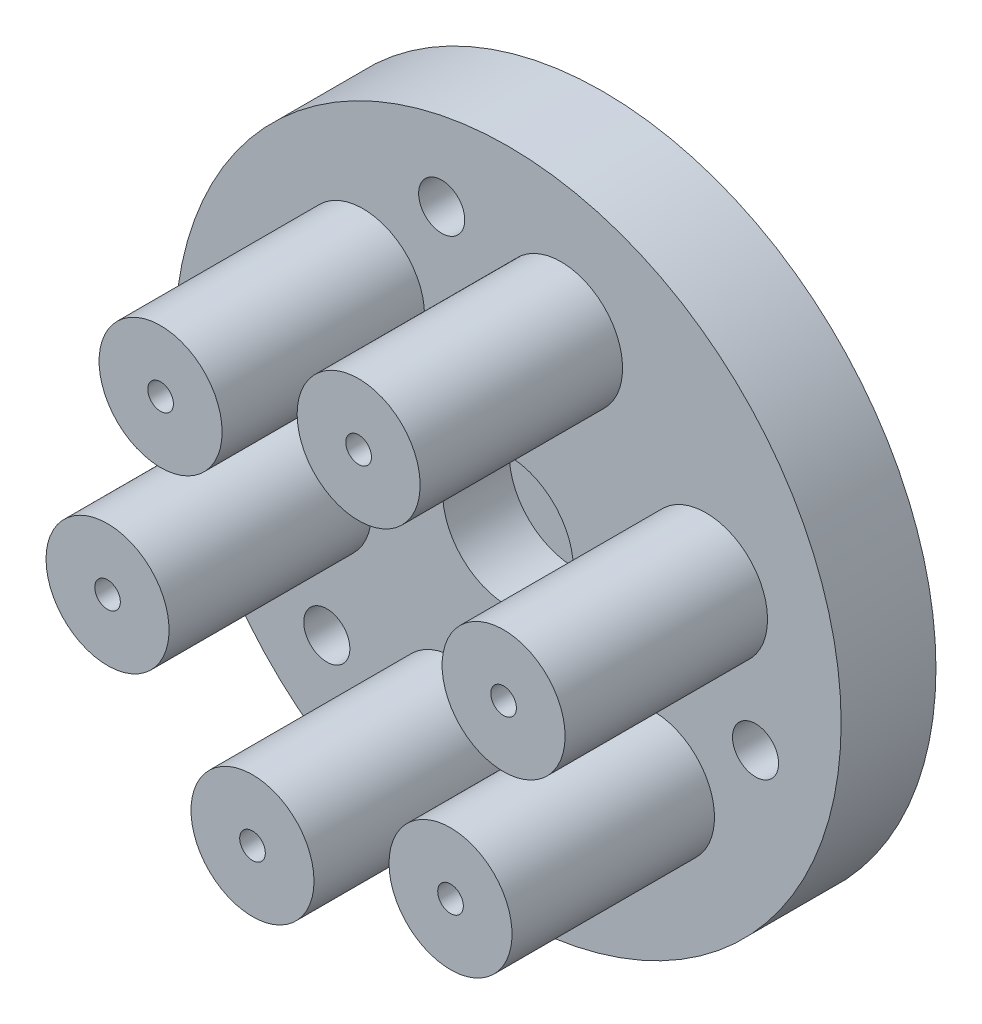
ISO-10303-21;
HEADER;
FILE_DESCRIPTION(('STEP AP214'),'2;1');
FILE_NAME('part.step','',(''),(''),'','','');
FILE_SCHEMA(('AUTOMOTIVE_DESIGN { 1 0 10303 214 1 1 1 1 }'));
ENDSEC;
DATA;
#1=APPLICATION_CONTEXT('core data for automotive mechanical design processes');
#2=APPLICATION_PROTOCOL_DEFINITION('international standard','automotive_design',2000,#1);
#3=PRODUCT_CONTEXT('',#1,'mechanical');
#4=PRODUCT('Part','Part','',(#3));
#5=PRODUCT_RELATED_PRODUCT_CATEGORY('part','',(#4));
#6=PRODUCT_DEFINITION_FORMATION('','',#4);
#7=PRODUCT_DEFINITION_CONTEXT('part definition',#1,'design');
#8=PRODUCT_DEFINITION('design','',#6,#7);
#9=PRODUCT_DEFINITION_SHAPE('','',#8);
#10=(LENGTH_UNIT() NAMED_UNIT(*) SI_UNIT(.MILLI.,.METRE.));
#11=(NAMED_UNIT(*) PLANE_ANGLE_UNIT() SI_UNIT($,.RADIAN.));
#12=(NAMED_UNIT(*) SI_UNIT($,.STERADIAN.) SOLID_ANGLE_UNIT());
#13=UNCERTAINTY_MEASURE_WITH_UNIT(LENGTH_MEASURE(1.E-05),#10,'distance_accuracy_value','');
#14=(GEOMETRIC_REPRESENTATION_CONTEXT(3) GLOBAL_UNCERTAINTY_ASSIGNED_CONTEXT((#13)) GLOBAL_UNIT_ASSIGNED_CONTEXT((#10,
#11,#12)) REPRESENTATION_CONTEXT('',''));
#15=CARTESIAN_POINT('',(0.,0.,0.));
#16=DIRECTION('',(0.,0.,1.));
#17=DIRECTION('',(1.,0.,0.));
#18=AXIS2_PLACEMENT_3D('',#15,#16,#17);
#19=CARTESIAN_POINT('',(0.,0.,0.));
#20=DIRECTION('',(0.,0.,1.));
#21=DIRECTION('',(1.,0.,0.));
#22=AXIS2_PLACEMENT_3D('',#19,#20,#21);
#23=CYLINDRICAL_SURFACE('',#22,1.1);
#24=CARTESIAN_POINT('',(0.,0.,0.));
#25=DIRECTION('',(0.,0.,1.));
#26=DIRECTION('',(1.,0.,0.));
#27=AXIS2_PLACEMENT_3D('',#24,#25,#26);
#28=CIRCLE('',#27,1.1);
#29=CARTESIAN_POINT('',(1.1,0.,0.));
#30=VERTEX_POINT('',#29);
#31=EDGE_CURVE('E134',#30,#30,#28,.T.);
#32=ORIENTED_EDGE('',*,*,#31,.F.);
#33=EDGE_LOOP('',(#32));
#34=FACE_BOUND('',#33,.T.);
#35=CARTESIAN_POINT('',(0.,0.,1.1));
#36=DIRECTION('',(0.,0.,1.));
#37=DIRECTION('',(1.,0.,0.));
#38=AXIS2_PLACEMENT_3D('',#35,#36,#37);
#39=CIRCLE('',#38,1.1);
#40=CARTESIAN_POINT('',(1.1,0.,1.1));
#41=VERTEX_POINT('',#40);
#42=EDGE_CURVE('E148',#41,#41,#39,.T.);
#43=ORIENTED_EDGE('',*,*,#42,.T.);
#44=EDGE_LOOP('',(#43));
#45=FACE_BOUND('',#44,.T.);
#46=ADVANCED_FACE('F37',(#34,#45),#23,.F.);
#47=CARTESIAN_POINT('',(0.,0.,3.7));
#48=DIRECTION('',(0.,0.,-1.));
#49=DIRECTION('',(-1.,0.,0.));
#50=AXIS2_PLACEMENT_3D('',#47,#48,#49);
#51=CYLINDRICAL_SURFACE('',#50,13.);
#52=CARTESIAN_POINT('',(0.,0.,3.7));
#53=DIRECTION('',(0.,0.,1.));
#54=DIRECTION('',(1.,0.,0.));
#55=AXIS2_PLACEMENT_3D('',#52,#53,#54);
#56=CIRCLE('',#55,13.);
#57=CARTESIAN_POINT('',(13.,0.,3.7));
#58=VERTEX_POINT('',#57);
#59=EDGE_CURVE('E63',#58,#58,#56,.T.);
#60=ORIENTED_EDGE('',*,*,#59,.F.);
#61=EDGE_LOOP('',(#60));
#62=FACE_BOUND('',#61,.T.);
#63=CARTESIAN_POINT('',(0.,0.,0.));
#64=DIRECTION('',(0.,0.,1.));
#65=DIRECTION('',(1.,0.,0.));
#66=AXIS2_PLACEMENT_3D('',#63,#64,#65);
#67=CIRCLE('',#66,13.);
#68=CARTESIAN_POINT('',(13.,0.,0.));
#69=VERTEX_POINT('',#68);
#70=EDGE_CURVE('E64',#69,#69,#67,.T.);
#71=ORIENTED_EDGE('',*,*,#70,.T.);
#72=EDGE_LOOP('',(#71));
#73=FACE_BOUND('',#72,.T.);
#74=ADVANCED_FACE('F39',(#62,#73),#51,.T.);
#75=CARTESIAN_POINT('',(0.,0.,3.7));
#76=DIRECTION('',(0.,0.,1.));
#77=DIRECTION('',(1.,0.,0.));
#78=AXIS2_PLACEMENT_3D('',#75,#76,#77);
#79=PLANE('',#78);
#80=CARTESIAN_POINT('',(0.,0.,3.7));
#81=DIRECTION('',(0.,0.,1.));
#82=DIRECTION('',(1.,0.,0.));
#83=AXIS2_PLACEMENT_3D('',#80,#81,#82);
#84=CIRCLE('',#83,2.55);
#85=CARTESIAN_POINT('',(2.55,0.,3.7));
#86=VERTEX_POINT('',#85);
#87=EDGE_CURVE('E145',#86,#86,#84,.T.);
#88=ORIENTED_EDGE('',*,*,#87,.F.);
#89=EDGE_LOOP('',(#88));
#90=FACE_BOUND('',#89,.T.);
#91=CARTESIAN_POINT('',(-7.07106781186549,-7.07106781186546,3.7));
#92=DIRECTION('',(0.,0.,1.));
#93=DIRECTION('',(-0.500000000000004,0.866025403784436,0.));
#94=AXIS2_PLACEMENT_3D('',#91,#92,#93);
#95=CIRCLE('',#94,0.9);
#96=CARTESIAN_POINT('',(-7.52106781186549,-6.29164494845947,3.7));
#97=VERTEX_POINT('',#96);
#98=EDGE_CURVE('E137',#97,#97,#95,.T.);
#99=ORIENTED_EDGE('',*,*,#98,.F.);
#100=EDGE_LOOP('',(#99));
#101=FACE_BOUND('',#100,.T.);
#102=CARTESIAN_POINT('',(9.65925826289069,-2.58819045102518,3.7));
#103=DIRECTION('',(0.,0.,1.));
#104=DIRECTION('',(-0.499999999999992,-0.866025403784443,0.));
#105=AXIS2_PLACEMENT_3D('',#102,#103,#104);
#106=CIRCLE('',#105,0.9);
#107=CARTESIAN_POINT('',(9.2092582628907,-3.36761331443118,3.7));
#108=VERTEX_POINT('',#107);
#109=EDGE_CURVE('E130',#108,#108,#106,.T.);
#110=ORIENTED_EDGE('',*,*,#109,.F.);
#111=EDGE_LOOP('',(#110));
#112=FACE_BOUND('',#111,.T.);
#113=CARTESIAN_POINT('',(-2.58819045102514,9.6592582628907,3.7));
#114=DIRECTION('',(0.,0.,1.));
#115=DIRECTION('',(1.,0.,0.));
#116=AXIS2_PLACEMENT_3D('',#113,#114,#115);
#117=CIRCLE('',#116,0.9);
#118=CARTESIAN_POINT('',(-1.68819045102515,9.6592582628907,3.7));
#119=VERTEX_POINT('',#118);
#120=EDGE_CURVE('E124',#119,#119,#117,.T.);
#121=ORIENTED_EDGE('',*,*,#120,.F.);
#122=EDGE_LOOP('',(#121));
#123=FACE_BOUND('',#122,.T.);
#124=CARTESIAN_POINT('',(-7.72740661031258,-2.07055236082003,3.7));
#125=DIRECTION('',(0.,0.,1.));
#126=DIRECTION('',(0.50000000000001,0.866025403784433,0.));
#127=AXIS2_PLACEMENT_3D('',#124,#125,#126);
#128=CIRCLE('',#127,2.4);
#129=CARTESIAN_POINT('',(-6.52740661031256,0.00790860826260396,3.7));
#130=VERTEX_POINT('',#129);
#131=EDGE_CURVE('E115',#130,#130,#128,.T.);
#132=ORIENTED_EDGE('',*,*,#131,.F.);
#133=EDGE_LOOP('',(#132));
#134=FACE_BOUND('',#133,.T.);
#135=CARTESIAN_POINT('',(-2.07055236082028,-7.72740661031252,3.7));
#136=DIRECTION('',(0.,0.,1.));
#137=DIRECTION('',(-0.499999999999992,0.866025403784443,0.));
#138=AXIS2_PLACEMENT_3D('',#135,#136,#137);
#139=CIRCLE('',#138,2.4);
#140=CARTESIAN_POINT('',(-3.27055236082026,-5.64894564122985,3.7));
#141=VERTEX_POINT('',#140);
#142=EDGE_CURVE('E106',#141,#141,#139,.T.);
#143=ORIENTED_EDGE('',*,*,#142,.F.);
#144=EDGE_LOOP('',(#143));
#145=FACE_BOUND('',#144,.T.);
#146=CARTESIAN_POINT('',(5.65685424949235,-5.65685424949241,3.7));
#147=DIRECTION('',(0.,0.,1.));
#148=DIRECTION('',(-1.,0.,0.));
#149=AXIS2_PLACEMENT_3D('',#146,#147,#148);
#150=CIRCLE('',#149,2.4);
#151=CARTESIAN_POINT('',(3.25685424949235,-5.65685424949241,3.7));
#152=VERTEX_POINT('',#151);
#153=EDGE_CURVE('E97',#152,#152,#150,.T.);
#154=ORIENTED_EDGE('',*,*,#153,.F.);
#155=EDGE_LOOP('',(#154));
#156=FACE_BOUND('',#155,.T.);
#157=CARTESIAN_POINT('',(7.72740661031257,2.07055236082009,3.7));
#158=DIRECTION('',(0.,0.,1.));
#159=DIRECTION('',(-0.500000000000004,-0.866025403784436,0.));
#160=AXIS2_PLACEMENT_3D('',#157,#158,#159);
#161=CIRCLE('',#160,2.4);
#162=CARTESIAN_POINT('',(6.52740661031256,-0.00790860826255799,3.7));
#163=VERTEX_POINT('',#162);
#164=EDGE_CURVE('E88',#163,#163,#161,.T.);
#165=ORIENTED_EDGE('',*,*,#164,.F.);
#166=EDGE_LOOP('',(#165));
#167=FACE_BOUND('',#166,.T.);
#168=CARTESIAN_POINT('',(2.07055236082022,7.72740661031253,3.7));
#169=DIRECTION('',(0.,0.,1.));
#170=DIRECTION('',(0.499999999999998,-0.86602540378444,0.));
#171=AXIS2_PLACEMENT_3D('',#168,#169,#170);
#172=CIRCLE('',#171,2.4);
#173=CARTESIAN_POINT('',(3.27055236082022,5.64894564122988,3.7));
#174=VERTEX_POINT('',#173);
#175=EDGE_CURVE('E79',#174,#174,#172,.T.);
#176=ORIENTED_EDGE('',*,*,#175,.F.);
#177=EDGE_LOOP('',(#176));
#178=FACE_BOUND('',#177,.T.);
#179=CARTESIAN_POINT('',(-5.65685424949235,5.65685424949241,3.7));
#180=DIRECTION('',(0.,0.,1.));
#181=DIRECTION('',(1.,0.,0.));
#182=AXIS2_PLACEMENT_3D('',#179,#180,#181);
#183=CIRCLE('',#182,2.4);
#184=CARTESIAN_POINT('',(-3.25685424949235,5.65685424949241,3.7));
#185=VERTEX_POINT('',#184);
#186=EDGE_CURVE('E70',#185,#185,#183,.T.);
#187=ORIENTED_EDGE('',*,*,#186,.F.);
#188=EDGE_LOOP('',(#187));
#189=FACE_BOUND('',#188,.T.);
#190=ORIENTED_EDGE('',*,*,#59,.T.);
#191=EDGE_LOOP('',(#190));
#192=FACE_BOUND('',#191,.T.);
#193=ADVANCED_FACE('F168',(#90,#101,#112,#123,#134,#145,#156,#167,#178,#189,#192),#79,.T.);
#194=CARTESIAN_POINT('',(0.,0.,0.));
#195=DIRECTION('',(0.,0.,1.));
#196=DIRECTION('',(1.,0.,0.));
#197=AXIS2_PLACEMENT_3D('',#194,#195,#196);
#198=PLANE('',#197);
#199=ORIENTED_EDGE('',*,*,#31,.T.);
#200=EDGE_LOOP('',(#199));
#201=FACE_BOUND('',#200,.T.);
#202=CARTESIAN_POINT('',(-7.07106781186549,-7.07106781186546,0.));
#203=DIRECTION('',(0.,0.,1.));
#204=DIRECTION('',(-0.500000000000004,0.866025403784436,0.));
#205=AXIS2_PLACEMENT_3D('',#202,#203,#204);
#206=CIRCLE('',#205,0.9);
#207=CARTESIAN_POINT('',(-7.52106781186549,-6.29164494845947,0.));
#208=VERTEX_POINT('',#207);
#209=EDGE_CURVE('E127',#208,#208,#206,.T.);
#210=ORIENTED_EDGE('',*,*,#209,.T.);
#211=EDGE_LOOP('',(#210));
#212=FACE_BOUND('',#211,.T.);
#213=CARTESIAN_POINT('',(9.65925826289069,-2.58819045102518,0.));
#214=DIRECTION('',(0.,0.,1.));
#215=DIRECTION('',(-0.499999999999992,-0.866025403784443,0.));
#216=AXIS2_PLACEMENT_3D('',#213,#214,#215);
#217=CIRCLE('',#216,0.9);
#218=CARTESIAN_POINT('',(9.2092582628907,-3.36761331443118,0.));
#219=VERTEX_POINT('',#218);
#220=EDGE_CURVE('E133',#219,#219,#217,.T.);
#221=ORIENTED_EDGE('',*,*,#220,.T.);
#222=EDGE_LOOP('',(#221));
#223=FACE_BOUND('',#222,.T.);
#224=CARTESIAN_POINT('',(-2.58819045102514,9.6592582628907,0.));
#225=DIRECTION('',(0.,0.,1.));
#226=DIRECTION('',(1.,0.,0.));
#227=AXIS2_PLACEMENT_3D('',#224,#225,#226);
#228=CIRCLE('',#227,0.9);
#229=CARTESIAN_POINT('',(-1.68819045102515,9.6592582628907,0.));
#230=VERTEX_POINT('',#229);
#231=EDGE_CURVE('E123',#230,#230,#228,.T.);
#232=ORIENTED_EDGE('',*,*,#231,.T.);
#233=EDGE_LOOP('',(#232));
#234=FACE_BOUND('',#233,.T.);
#235=ORIENTED_EDGE('',*,*,#70,.F.);
#236=EDGE_LOOP('',(#235));
#237=FACE_BOUND('',#236,.T.);
#238=ADVANCED_FACE('F171',(#201,#212,#223,#234,#237),#198,.F.);
#239=CARTESIAN_POINT('',(-5.65685424949235,5.65685424949241,11.6));
#240=DIRECTION('',(0.,0.,1.));
#241=DIRECTION('',(1.,0.,0.));
#242=AXIS2_PLACEMENT_3D('',#239,#240,#241);
#243=PLANE('',#242);
#244=CARTESIAN_POINT('',(-5.65685424949235,5.65685424949241,11.6));
#245=DIRECTION('',(0.,0.,1.));
#246=DIRECTION('',(1.,0.,0.));
#247=AXIS2_PLACEMENT_3D('',#244,#245,#246);
#248=CIRCLE('',#247,2.4);
#249=CARTESIAN_POINT('',(-3.25685424949235,5.65685424949241,11.6));
#250=VERTEX_POINT('',#249);
#251=EDGE_CURVE('E67',#250,#250,#248,.T.);
#252=ORIENTED_EDGE('',*,*,#251,.T.);
#253=EDGE_LOOP('',(#252));
#254=FACE_BOUND('',#253,.T.);
#255=CARTESIAN_POINT('',(-5.65685424949235,5.65685424949241,11.6));
#256=DIRECTION('',(0.,0.,1.));
#257=DIRECTION('',(1.,0.,0.));
#258=AXIS2_PLACEMENT_3D('',#255,#256,#257);
#259=CIRCLE('',#258,0.500000000000001);
#260=CARTESIAN_POINT('',(-5.15685424949235,5.65685424949241,11.6));
#261=VERTEX_POINT('',#260);
#262=EDGE_CURVE('E73',#261,#261,#259,.T.);
#263=ORIENTED_EDGE('',*,*,#262,.F.);
#264=EDGE_LOOP('',(#263));
#265=FACE_BOUND('',#264,.T.);
#266=ADVANCED_FACE('F200',(#254,#265),#243,.T.);
#267=CARTESIAN_POINT('',(-5.65685424949235,5.65685424949241,11.6));
#268=DIRECTION('',(0.,0.,-1.));
#269=DIRECTION('',(-1.,0.,0.));
#270=AXIS2_PLACEMENT_3D('',#267,#268,#269);
#271=CYLINDRICAL_SURFACE('',#270,2.4);
#272=ORIENTED_EDGE('',*,*,#251,.F.);
#273=EDGE_LOOP('',(#272));
#274=FACE_BOUND('',#273,.T.);
#275=ORIENTED_EDGE('',*,*,#186,.T.);
#276=EDGE_LOOP('',(#275));
#277=FACE_BOUND('',#276,.T.);
#278=ADVANCED_FACE('F205',(#274,#277),#271,.T.);
#279=CARTESIAN_POINT('',(-5.65685424949235,5.65685424949241,11.6));
#280=DIRECTION('',(0.,0.,-1.));
#281=DIRECTION('',(-1.,0.,0.));
#282=AXIS2_PLACEMENT_3D('',#279,#280,#281);
#283=CYLINDRICAL_SURFACE('',#282,0.500000000000001);
#284=ORIENTED_EDGE('',*,*,#262,.T.);
#285=EDGE_LOOP('',(#284));
#286=FACE_BOUND('',#285,.T.);
#287=CARTESIAN_POINT('',(-5.65685424949235,5.65685424949241,3.7));
#288=DIRECTION('',(0.,0.,1.));
#289=DIRECTION('',(1.,0.,0.));
#290=AXIS2_PLACEMENT_3D('',#287,#288,#289);
#291=CIRCLE('',#290,0.500000000000001);
#292=CARTESIAN_POINT('',(-5.15685424949235,5.65685424949241,3.7));
#293=VERTEX_POINT('',#292);
#294=EDGE_CURVE('E60',#293,#293,#291,.F.);
#295=ORIENTED_EDGE('',*,*,#294,.T.);
#296=EDGE_LOOP('',(#295));
#297=FACE_BOUND('',#296,.T.);
#298=ADVANCED_FACE('F291',(#286,#297),#283,.F.);
#299=ORIENTED_EDGE('',*,*,#294,.F.);
#300=EDGE_LOOP('',(#299));
#301=FACE_BOUND('',#300,.T.);
#302=ADVANCED_FACE('F174',(#301),#79,.T.);
#303=CARTESIAN_POINT('',(2.07055236082022,7.72740661031253,11.6));
#304=DIRECTION('',(0.,0.,1.));
#305=DIRECTION('',(0.499999999999998,-0.86602540378444,0.));
#306=AXIS2_PLACEMENT_3D('',#303,#304,#305);
#307=PLANE('',#306);
#308=CARTESIAN_POINT('',(2.07055236082022,7.72740661031253,11.6));
#309=DIRECTION('',(0.,0.,1.));
#310=DIRECTION('',(0.499999999999998,-0.86602540378444,0.));
#311=AXIS2_PLACEMENT_3D('',#308,#309,#310);
#312=CIRCLE('',#311,2.4);
#313=CARTESIAN_POINT('',(3.27055236082022,5.64894564122988,11.6));
#314=VERTEX_POINT('',#313);
#315=EDGE_CURVE('E78',#314,#314,#312,.T.);
#316=ORIENTED_EDGE('',*,*,#315,.T.);
#317=EDGE_LOOP('',(#316));
#318=FACE_BOUND('',#317,.T.);
#319=CARTESIAN_POINT('',(2.07055236082022,7.72740661031253,11.6));
#320=DIRECTION('',(0.,0.,1.));
#321=DIRECTION('',(0.499999999999998,-0.86602540378444,0.));
#322=AXIS2_PLACEMENT_3D('',#319,#320,#321);
#323=CIRCLE('',#322,0.500000000000001);
#324=CARTESIAN_POINT('',(2.32055236082022,7.29439390842031,11.6));
#325=VERTEX_POINT('',#324);
#326=EDGE_CURVE('E82',#325,#325,#323,.T.);
#327=ORIENTED_EDGE('',*,*,#326,.F.);
#328=EDGE_LOOP('',(#327));
#329=FACE_BOUND('',#328,.T.);
#330=ADVANCED_FACE('F284',(#318,#329),#307,.T.);
#331=CARTESIAN_POINT('',(2.07055236082022,7.72740661031253,11.6));
#332=DIRECTION('',(0.,0.,-1.));
#333=DIRECTION('',(-1.,0.,0.));
#334=AXIS2_PLACEMENT_3D('',#331,#332,#333);
#335=CYLINDRICAL_SURFACE('',#334,2.4);
#336=ORIENTED_EDGE('',*,*,#315,.F.);
#337=EDGE_LOOP('',(#336));
#338=FACE_BOUND('',#337,.T.);
#339=ORIENTED_EDGE('',*,*,#175,.T.);
#340=EDGE_LOOP('',(#339));
#341=FACE_BOUND('',#340,.T.);
#342=ADVANCED_FACE('F282',(#338,#341),#335,.T.);
#343=CARTESIAN_POINT('',(2.07055236082022,7.72740661031253,11.6));
#344=DIRECTION('',(0.,0.,-1.));
#345=DIRECTION('',(-1.,0.,0.));
#346=AXIS2_PLACEMENT_3D('',#343,#344,#345);
#347=CYLINDRICAL_SURFACE('',#346,0.500000000000001);
#348=ORIENTED_EDGE('',*,*,#326,.T.);
#349=EDGE_LOOP('',(#348));
#350=FACE_BOUND('',#349,.T.);
#351=CARTESIAN_POINT('',(2.07055236082022,7.72740661031253,3.7));
#352=DIRECTION('',(0.,0.,1.));
#353=DIRECTION('',(1.,0.,0.));
#354=AXIS2_PLACEMENT_3D('',#351,#352,#353);
#355=CIRCLE('',#354,0.500000000000001);
#356=CARTESIAN_POINT('',(2.57055236082023,7.72740661031253,3.7));
#357=VERTEX_POINT('',#356);
#358=EDGE_CURVE('E57',#357,#357,#355,.F.);
#359=ORIENTED_EDGE('',*,*,#358,.T.);
#360=EDGE_LOOP('',(#359));
#361=FACE_BOUND('',#360,.T.);
#362=ADVANCED_FACE('F279',(#350,#361),#347,.F.);
#363=ORIENTED_EDGE('',*,*,#358,.F.);
#364=EDGE_LOOP('',(#363));
#365=FACE_BOUND('',#364,.T.);
#366=ADVANCED_FACE('F274',(#365),#79,.T.);
#367=CARTESIAN_POINT('',(7.72740661031257,2.07055236082009,11.6));
#368=DIRECTION('',(0.,0.,1.));
#369=DIRECTION('',(-0.500000000000004,-0.866025403784436,0.));
#370=AXIS2_PLACEMENT_3D('',#367,#368,#369);
#371=PLANE('',#370);
#372=CARTESIAN_POINT('',(7.72740661031257,2.07055236082009,11.6));
#373=DIRECTION('',(0.,0.,1.));
#374=DIRECTION('',(-0.500000000000004,-0.866025403784436,0.));
#375=AXIS2_PLACEMENT_3D('',#372,#373,#374);
#376=CIRCLE('',#375,2.4);
#377=CARTESIAN_POINT('',(6.52740661031256,-0.00790860826255799,11.6));
#378=VERTEX_POINT('',#377);
#379=EDGE_CURVE('E87',#378,#378,#376,.T.);
#380=ORIENTED_EDGE('',*,*,#379,.T.);
#381=EDGE_LOOP('',(#380));
#382=FACE_BOUND('',#381,.T.);
#383=CARTESIAN_POINT('',(7.72740661031257,2.07055236082009,11.6));
#384=DIRECTION('',(0.,0.,1.));
#385=DIRECTION('',(-0.500000000000004,-0.866025403784436,0.));
#386=AXIS2_PLACEMENT_3D('',#383,#384,#385);
#387=CIRCLE('',#386,0.500000000000001);
#388=CARTESIAN_POINT('',(7.47740661031257,1.63753965892787,11.6));
#389=VERTEX_POINT('',#388);
#390=EDGE_CURVE('E91',#389,#389,#387,.T.);
#391=ORIENTED_EDGE('',*,*,#390,.F.);
#392=EDGE_LOOP('',(#391));
#393=FACE_BOUND('',#392,.T.);
#394=ADVANCED_FACE('F271',(#382,#393),#371,.T.);
#395=CARTESIAN_POINT('',(7.72740661031257,2.07055236082009,11.6));
#396=DIRECTION('',(0.,0.,-1.));
#397=DIRECTION('',(-1.,0.,0.));
#398=AXIS2_PLACEMENT_3D('',#395,#396,#397);
#399=CYLINDRICAL_SURFACE('',#398,2.4);
#400=ORIENTED_EDGE('',*,*,#379,.F.);
#401=EDGE_LOOP('',(#400));
#402=FACE_BOUND('',#401,.T.);
#403=ORIENTED_EDGE('',*,*,#164,.T.);
#404=EDGE_LOOP('',(#403));
#405=FACE_BOUND('',#404,.T.);
#406=ADVANCED_FACE('F269',(#402,#405),#399,.T.);
#407=CARTESIAN_POINT('',(7.72740661031257,2.07055236082009,11.6));
#408=DIRECTION('',(0.,0.,-1.));
#409=DIRECTION('',(-1.,0.,0.));
#410=AXIS2_PLACEMENT_3D('',#407,#408,#409);
#411=CYLINDRICAL_SURFACE('',#410,0.500000000000001);
#412=ORIENTED_EDGE('',*,*,#390,.T.);
#413=EDGE_LOOP('',(#412));
#414=FACE_BOUND('',#413,.T.);
#415=CARTESIAN_POINT('',(7.72740661031257,2.07055236082009,3.7));
#416=DIRECTION('',(0.,0.,1.));
#417=DIRECTION('',(1.,0.,0.));
#418=AXIS2_PLACEMENT_3D('',#415,#416,#417);
#419=CIRCLE('',#418,0.500000000000001);
#420=CARTESIAN_POINT('',(8.22740661031257,2.07055236082009,3.7));
#421=VERTEX_POINT('',#420);
#422=EDGE_CURVE('E52',#421,#421,#419,.F.);
#423=ORIENTED_EDGE('',*,*,#422,.T.);
#424=EDGE_LOOP('',(#423));
#425=FACE_BOUND('',#424,.T.);
#426=ADVANCED_FACE('F266',(#414,#425),#411,.F.);
#427=ORIENTED_EDGE('',*,*,#422,.F.);
#428=EDGE_LOOP('',(#427));
#429=FACE_BOUND('',#428,.T.);
#430=ADVANCED_FACE('F261',(#429),#79,.T.);
#431=CARTESIAN_POINT('',(5.65685424949235,-5.65685424949241,11.6));
#432=DIRECTION('',(0.,0.,1.));
#433=DIRECTION('',(-1.,0.,0.));
#434=AXIS2_PLACEMENT_3D('',#431,#432,#433);
#435=PLANE('',#434);
#436=CARTESIAN_POINT('',(5.65685424949235,-5.65685424949241,11.6));
#437=DIRECTION('',(0.,0.,1.));
#438=DIRECTION('',(-1.,0.,0.));
#439=AXIS2_PLACEMENT_3D('',#436,#437,#438);
#440=CIRCLE('',#439,2.4);
#441=CARTESIAN_POINT('',(3.25685424949235,-5.65685424949241,11.6));
#442=VERTEX_POINT('',#441);
#443=EDGE_CURVE('E96',#442,#442,#440,.T.);
#444=ORIENTED_EDGE('',*,*,#443,.T.);
#445=EDGE_LOOP('',(#444));
#446=FACE_BOUND('',#445,.T.);
#447=CARTESIAN_POINT('',(5.65685424949235,-5.65685424949241,11.6));
#448=DIRECTION('',(0.,0.,1.));
#449=DIRECTION('',(-1.,0.,0.));
#450=AXIS2_PLACEMENT_3D('',#447,#448,#449);
#451=CIRCLE('',#450,0.500000000000001);
#452=CARTESIAN_POINT('',(5.15685424949235,-5.65685424949241,11.6));
#453=VERTEX_POINT('',#452);
#454=EDGE_CURVE('E100',#453,#453,#451,.T.);
#455=ORIENTED_EDGE('',*,*,#454,.F.);
#456=EDGE_LOOP('',(#455));
#457=FACE_BOUND('',#456,.T.);
#458=ADVANCED_FACE('F258',(#446,#457),#435,.T.);
#459=CARTESIAN_POINT('',(5.65685424949235,-5.65685424949241,11.6));
#460=DIRECTION('',(0.,0.,-1.));
#461=DIRECTION('',(-1.,0.,0.));
#462=AXIS2_PLACEMENT_3D('',#459,#460,#461);
#463=CYLINDRICAL_SURFACE('',#462,2.4);
#464=ORIENTED_EDGE('',*,*,#443,.F.);
#465=EDGE_LOOP('',(#464));
#466=FACE_BOUND('',#465,.T.);
#467=ORIENTED_EDGE('',*,*,#153,.T.);
#468=EDGE_LOOP('',(#467));
#469=FACE_BOUND('',#468,.T.);
#470=ADVANCED_FACE('F256',(#466,#469),#463,.T.);
#471=CARTESIAN_POINT('',(5.65685424949235,-5.65685424949241,11.6));
#472=DIRECTION('',(0.,0.,-1.));
#473=DIRECTION('',(-1.,0.,0.));
#474=AXIS2_PLACEMENT_3D('',#471,#472,#473);
#475=CYLINDRICAL_SURFACE('',#474,0.500000000000001);
#476=ORIENTED_EDGE('',*,*,#454,.T.);
#477=EDGE_LOOP('',(#476));
#478=FACE_BOUND('',#477,.T.);
#479=CARTESIAN_POINT('',(5.65685424949235,-5.65685424949241,3.7));
#480=DIRECTION('',(0.,0.,1.));
#481=DIRECTION('',(1.,0.,0.));
#482=AXIS2_PLACEMENT_3D('',#479,#480,#481);
#483=CIRCLE('',#482,0.500000000000001);
#484=CARTESIAN_POINT('',(6.15685424949235,-5.65685424949241,3.7));
#485=VERTEX_POINT('',#484);
#486=EDGE_CURVE('E48',#485,#485,#483,.F.);
#487=ORIENTED_EDGE('',*,*,#486,.T.);
#488=EDGE_LOOP('',(#487));
#489=FACE_BOUND('',#488,.T.);
#490=ADVANCED_FACE('F253',(#478,#489),#475,.F.);
#491=ORIENTED_EDGE('',*,*,#486,.F.);
#492=EDGE_LOOP('',(#491));
#493=FACE_BOUND('',#492,.T.);
#494=ADVANCED_FACE('F248',(#493),#79,.T.);
#495=CARTESIAN_POINT('',(-2.07055236082028,-7.72740661031252,11.6));
#496=DIRECTION('',(0.,0.,1.));
#497=DIRECTION('',(-0.499999999999992,0.866025403784443,0.));
#498=AXIS2_PLACEMENT_3D('',#495,#496,#497);
#499=PLANE('',#498);
#500=CARTESIAN_POINT('',(-2.07055236082028,-7.72740661031252,11.6));
#501=DIRECTION('',(0.,0.,1.));
#502=DIRECTION('',(-0.499999999999992,0.866025403784443,0.));
#503=AXIS2_PLACEMENT_3D('',#500,#501,#502);
#504=CIRCLE('',#503,2.4);
#505=CARTESIAN_POINT('',(-3.27055236082026,-5.64894564122985,11.6));
#506=VERTEX_POINT('',#505);
#507=EDGE_CURVE('E105',#506,#506,#504,.T.);
#508=ORIENTED_EDGE('',*,*,#507,.T.);
#509=EDGE_LOOP('',(#508));
#510=FACE_BOUND('',#509,.T.);
#511=CARTESIAN_POINT('',(-2.07055236082028,-7.72740661031252,11.6));
#512=DIRECTION('',(0.,0.,1.));
#513=DIRECTION('',(-0.499999999999992,0.866025403784443,0.));
#514=AXIS2_PLACEMENT_3D('',#511,#512,#513);
#515=CIRCLE('',#514,0.500000000000001);
#516=CARTESIAN_POINT('',(-2.32055236082027,-7.29439390842029,11.6));
#517=VERTEX_POINT('',#516);
#518=EDGE_CURVE('E109',#517,#517,#515,.T.);
#519=ORIENTED_EDGE('',*,*,#518,.F.);
#520=EDGE_LOOP('',(#519));
#521=FACE_BOUND('',#520,.T.);
#522=ADVANCED_FACE('F245',(#510,#521),#499,.T.);
#523=CARTESIAN_POINT('',(-2.07055236082028,-7.72740661031252,11.6));
#524=DIRECTION('',(0.,0.,-1.));
#525=DIRECTION('',(-1.,0.,0.));
#526=AXIS2_PLACEMENT_3D('',#523,#524,#525);
#527=CYLINDRICAL_SURFACE('',#526,2.4);
#528=ORIENTED_EDGE('',*,*,#507,.F.);
#529=EDGE_LOOP('',(#528));
#530=FACE_BOUND('',#529,.T.);
#531=ORIENTED_EDGE('',*,*,#142,.T.);
#532=EDGE_LOOP('',(#531));
#533=FACE_BOUND('',#532,.T.);
#534=ADVANCED_FACE('F243',(#530,#533),#527,.T.);
#535=CARTESIAN_POINT('',(-2.07055236082028,-7.72740661031252,11.6));
#536=DIRECTION('',(0.,0.,-1.));
#537=DIRECTION('',(-1.,0.,0.));
#538=AXIS2_PLACEMENT_3D('',#535,#536,#537);
#539=CYLINDRICAL_SURFACE('',#538,0.500000000000001);
#540=ORIENTED_EDGE('',*,*,#518,.T.);
#541=EDGE_LOOP('',(#540));
#542=FACE_BOUND('',#541,.T.);
#543=CARTESIAN_POINT('',(-2.07055236082028,-7.72740661031252,3.7));
#544=DIRECTION('',(0.,0.,1.));
#545=DIRECTION('',(1.,0.,0.));
#546=AXIS2_PLACEMENT_3D('',#543,#544,#545);
#547=CIRCLE('',#546,0.500000000000001);
#548=CARTESIAN_POINT('',(-1.57055236082028,-7.72740661031252,3.7));
#549=VERTEX_POINT('',#548);
#550=EDGE_CURVE('E44',#549,#549,#547,.F.);
#551=ORIENTED_EDGE('',*,*,#550,.T.);
#552=EDGE_LOOP('',(#551));
#553=FACE_BOUND('',#552,.T.);
#554=ADVANCED_FACE('F240',(#542,#553),#539,.F.);
#555=ORIENTED_EDGE('',*,*,#550,.F.);
#556=EDGE_LOOP('',(#555));
#557=FACE_BOUND('',#556,.T.);
#558=ADVANCED_FACE('F235',(#557),#79,.T.);
#559=CARTESIAN_POINT('',(-7.72740661031258,-2.07055236082003,11.6));
#560=DIRECTION('',(0.,0.,1.));
#561=DIRECTION('',(0.50000000000001,0.866025403784433,0.));
#562=AXIS2_PLACEMENT_3D('',#559,#560,#561);
#563=PLANE('',#562);
#564=CARTESIAN_POINT('',(-7.72740661031258,-2.07055236082003,11.6));
#565=DIRECTION('',(0.,0.,1.));
#566=DIRECTION('',(0.50000000000001,0.866025403784433,0.));
#567=AXIS2_PLACEMENT_3D('',#564,#565,#566);
#568=CIRCLE('',#567,2.4);
#569=CARTESIAN_POINT('',(-6.52740661031256,0.00790860826260396,11.6));
#570=VERTEX_POINT('',#569);
#571=EDGE_CURVE('E114',#570,#570,#568,.T.);
#572=ORIENTED_EDGE('',*,*,#571,.T.);
#573=EDGE_LOOP('',(#572));
#574=FACE_BOUND('',#573,.T.);
#575=CARTESIAN_POINT('',(-7.72740661031258,-2.07055236082003,11.6));
#576=DIRECTION('',(0.,0.,1.));
#577=DIRECTION('',(0.50000000000001,0.866025403784433,0.));
#578=AXIS2_PLACEMENT_3D('',#575,#576,#577);
#579=CIRCLE('',#578,0.500000000000001);
#580=CARTESIAN_POINT('',(-7.47740661031258,-1.63753965892782,11.6));
#581=VERTEX_POINT('',#580);
#582=EDGE_CURVE('E118',#581,#581,#579,.T.);
#583=ORIENTED_EDGE('',*,*,#582,.F.);
#584=EDGE_LOOP('',(#583));
#585=FACE_BOUND('',#584,.T.);
#586=ADVANCED_FACE('F232',(#574,#585),#563,.T.);
#587=CARTESIAN_POINT('',(-7.72740661031258,-2.07055236082003,11.6));
#588=DIRECTION('',(0.,0.,-1.));
#589=DIRECTION('',(-1.,0.,0.));
#590=AXIS2_PLACEMENT_3D('',#587,#588,#589);
#591=CYLINDRICAL_SURFACE('',#590,2.4);
#592=ORIENTED_EDGE('',*,*,#571,.F.);
#593=EDGE_LOOP('',(#592));
#594=FACE_BOUND('',#593,.T.);
#595=ORIENTED_EDGE('',*,*,#131,.T.);
#596=EDGE_LOOP('',(#595));
#597=FACE_BOUND('',#596,.T.);
#598=ADVANCED_FACE('F230',(#594,#597),#591,.T.);
#599=CARTESIAN_POINT('',(-7.72740661031258,-2.07055236082003,11.6));
#600=DIRECTION('',(0.,0.,-1.));
#601=DIRECTION('',(-1.,0.,0.));
#602=AXIS2_PLACEMENT_3D('',#599,#600,#601);
#603=CYLINDRICAL_SURFACE('',#602,0.500000000000001);
#604=ORIENTED_EDGE('',*,*,#582,.T.);
#605=EDGE_LOOP('',(#604));
#606=FACE_BOUND('',#605,.T.);
#607=CARTESIAN_POINT('',(-7.72740661031258,-2.07055236082003,3.7));
#608=DIRECTION('',(0.,0.,1.));
#609=DIRECTION('',(1.,0.,0.));
#610=AXIS2_PLACEMENT_3D('',#607,#608,#609);
#611=CIRCLE('',#610,0.500000000000001);
#612=CARTESIAN_POINT('',(-7.22740661031258,-2.07055236082003,3.7));
#613=VERTEX_POINT('',#612);
#614=EDGE_CURVE('E10',#613,#613,#611,.F.);
#615=ORIENTED_EDGE('',*,*,#614,.T.);
#616=EDGE_LOOP('',(#615));
#617=FACE_BOUND('',#616,.T.);
#618=ADVANCED_FACE('F227',(#606,#617),#603,.F.);
#619=ORIENTED_EDGE('',*,*,#614,.F.);
#620=EDGE_LOOP('',(#619));
#621=FACE_BOUND('',#620,.T.);
#622=ADVANCED_FACE('F173',(#621),#79,.T.);
#623=CARTESIAN_POINT('',(-2.58819045102514,9.6592582628907,0.));
#624=DIRECTION('',(0.,0.,1.));
#625=DIRECTION('',(1.,0.,0.));
#626=AXIS2_PLACEMENT_3D('',#623,#624,#625);
#627=CYLINDRICAL_SURFACE('',#626,0.9);
#628=ORIENTED_EDGE('',*,*,#231,.F.);
#629=EDGE_LOOP('',(#628));
#630=FACE_BOUND('',#629,.T.);
#631=ORIENTED_EDGE('',*,*,#120,.T.);
#632=EDGE_LOOP('',(#631));
#633=FACE_BOUND('',#632,.T.);
#634=ADVANCED_FACE('F222',(#630,#633),#627,.F.);
#635=CARTESIAN_POINT('',(9.65925826289069,-2.58819045102518,0.));
#636=DIRECTION('',(0.,0.,1.));
#637=DIRECTION('',(1.,0.,0.));
#638=AXIS2_PLACEMENT_3D('',#635,#636,#637);
#639=CYLINDRICAL_SURFACE('',#638,0.9);
#640=ORIENTED_EDGE('',*,*,#220,.F.);
#641=EDGE_LOOP('',(#640));
#642=FACE_BOUND('',#641,.T.);
#643=ORIENTED_EDGE('',*,*,#109,.T.);
#644=EDGE_LOOP('',(#643));
#645=FACE_BOUND('',#644,.T.);
#646=ADVANCED_FACE('F218',(#642,#645),#639,.F.);
#647=CARTESIAN_POINT('',(-7.07106781186549,-7.07106781186546,0.));
#648=DIRECTION('',(0.,0.,1.));
#649=DIRECTION('',(1.,0.,0.));
#650=AXIS2_PLACEMENT_3D('',#647,#648,#649);
#651=CYLINDRICAL_SURFACE('',#650,0.9);
#652=ORIENTED_EDGE('',*,*,#209,.F.);
#653=EDGE_LOOP('',(#652));
#654=FACE_BOUND('',#653,.T.);
#655=ORIENTED_EDGE('',*,*,#98,.T.);
#656=EDGE_LOOP('',(#655));
#657=FACE_BOUND('',#656,.T.);
#658=ADVANCED_FACE('F164',(#654,#657),#651,.F.);
#659=CARTESIAN_POINT('',(0.,0.,1.1));
#660=DIRECTION('',(0.,0.,1.));
#661=DIRECTION('',(1.,0.,0.));
#662=AXIS2_PLACEMENT_3D('',#659,#660,#661);
#663=CYLINDRICAL_SURFACE('',#662,2.55);
#664=CARTESIAN_POINT('',(0.,0.,1.1));
#665=DIRECTION('',(0.,0.,1.));
#666=DIRECTION('',(1.,0.,0.));
#667=AXIS2_PLACEMENT_3D('',#664,#665,#666);
#668=CIRCLE('',#667,2.55);
#669=CARTESIAN_POINT('',(2.55,0.,1.1));
#670=VERTEX_POINT('',#669);
#671=EDGE_CURVE('E144',#670,#670,#668,.T.);
#672=ORIENTED_EDGE('',*,*,#671,.F.);
#673=EDGE_LOOP('',(#672));
#674=FACE_BOUND('',#673,.T.);
#675=ORIENTED_EDGE('',*,*,#87,.T.);
#676=EDGE_LOOP('',(#675));
#677=FACE_BOUND('',#676,.T.);
#678=ADVANCED_FACE('F158',(#674,#677),#663,.F.);
#679=CARTESIAN_POINT('',(0.,0.,1.1));
#680=DIRECTION('',(0.,0.,1.));
#681=DIRECTION('',(1.,0.,0.));
#682=AXIS2_PLACEMENT_3D('',#679,#680,#681);
#683=PLANE('',#682);
#684=ORIENTED_EDGE('',*,*,#42,.F.);
#685=EDGE_LOOP('',(#684));
#686=FACE_BOUND('',#685,.T.);
#687=ORIENTED_EDGE('',*,*,#671,.T.);
#688=EDGE_LOOP('',(#687));
#689=FACE_BOUND('',#688,.T.);
#690=ADVANCED_FACE('F155',(#686,#689),#683,.T.);
#691=CLOSED_SHELL('',(#46,#74,#193,#238,#266,#278,#298,#302,#330,#342,#362,#366,#394,#406,#426,
#430,#458,#470,#490,#494,#522,#534,#554,#558,#586,#598,#618,#622,#634,#646,#658,#678,#690));
#692=MANIFOLD_SOLID_BREP('B2',#691);
#693=ADVANCED_BREP_SHAPE_REPRESENTATION('',(#18,#692),#14);
#694=SHAPE_DEFINITION_REPRESENTATION(#9,#693);
ENDSEC;
END-ISO-10303-21;
